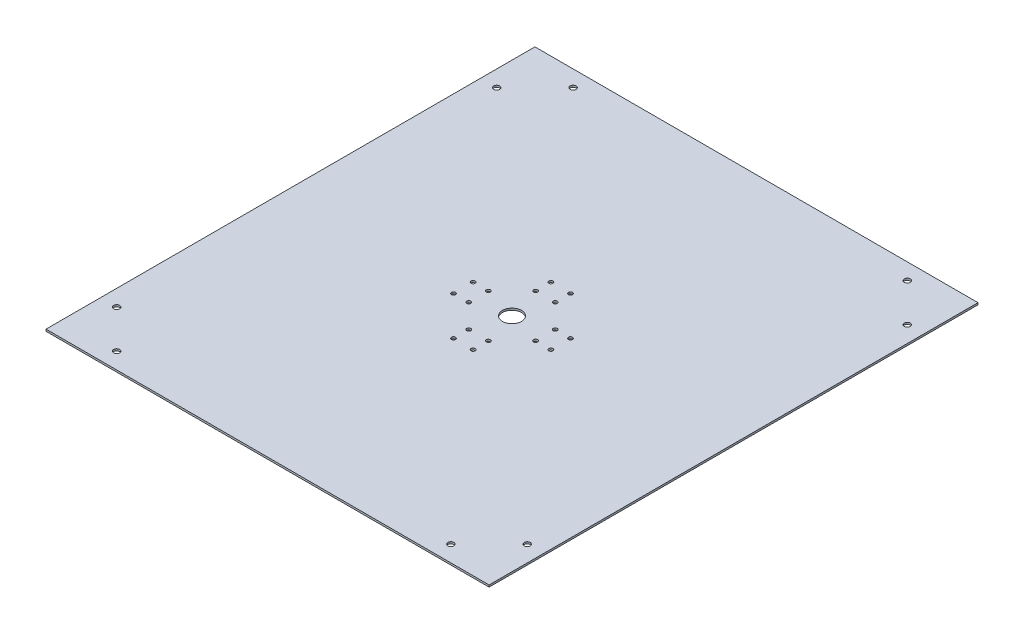
ISO-10303-21;
HEADER;
FILE_DESCRIPTION(('STEP AP214'),'2;1');
FILE_NAME('part.step','',(''),(''),'','','');
FILE_SCHEMA(('AUTOMOTIVE_DESIGN { 1 0 10303 214 1 1 1 1 }'));
ENDSEC;
DATA;
#1=APPLICATION_CONTEXT('core data for automotive mechanical design processes');
#2=APPLICATION_PROTOCOL_DEFINITION('international standard','automotive_design',2000,#1);
#3=PRODUCT_CONTEXT('',#1,'mechanical');
#4=PRODUCT('Part','Part','',(#3));
#5=PRODUCT_RELATED_PRODUCT_CATEGORY('part','',(#4));
#6=PRODUCT_DEFINITION_FORMATION('','',#4);
#7=PRODUCT_DEFINITION_CONTEXT('part definition',#1,'design');
#8=PRODUCT_DEFINITION('design','',#6,#7);
#9=PRODUCT_DEFINITION_SHAPE('','',#8);
#10=(LENGTH_UNIT() NAMED_UNIT(*) SI_UNIT(.MILLI.,.METRE.));
#11=(NAMED_UNIT(*) PLANE_ANGLE_UNIT() SI_UNIT($,.RADIAN.));
#12=(NAMED_UNIT(*) SI_UNIT($,.STERADIAN.) SOLID_ANGLE_UNIT());
#13=UNCERTAINTY_MEASURE_WITH_UNIT(LENGTH_MEASURE(1.E-05),#10,'distance_accuracy_value','');
#14=(GEOMETRIC_REPRESENTATION_CONTEXT(3) GLOBAL_UNCERTAINTY_ASSIGNED_CONTEXT((#13)) GLOBAL_UNIT_ASSIGNED_CONTEXT((#10,
#11,#12)) REPRESENTATION_CONTEXT('',''));
#15=CARTESIAN_POINT('',(0.,0.,0.));
#16=DIRECTION('',(0.,0.,1.));
#17=DIRECTION('',(1.,0.,0.));
#18=AXIS2_PLACEMENT_3D('',#15,#16,#17);
#19=CARTESIAN_POINT('',(232.,2.,256.));
#20=DIRECTION('',(-1.,0.,0.));
#21=DIRECTION('',(0.,0.,1.));
#22=AXIS2_PLACEMENT_3D('',#19,#20,#21);
#23=PLANE('',#22);
#24=DIRECTION('',(0.,0.,-1.));
#25=VECTOR('',#24,1.);
#26=CARTESIAN_POINT('',(232.,0.,256.));
#27=LINE('',#26,#25);
#28=CARTESIAN_POINT('',(232.,0.,256.));
#29=VERTEX_POINT('',#28);
#30=CARTESIAN_POINT('',(232.,0.,-256.));
#31=VERTEX_POINT('',#30);
#32=EDGE_CURVE('E113',#29,#31,#27,.T.);
#33=ORIENTED_EDGE('',*,*,#32,.T.);
#34=DIRECTION('',(0.,-1.,0.));
#35=VECTOR('',#34,1.);
#36=CARTESIAN_POINT('',(232.,2.,-256.));
#37=LINE('',#36,#35);
#38=CARTESIAN_POINT('',(232.,2.,-256.));
#39=VERTEX_POINT('',#38);
#40=EDGE_CURVE('E11',#39,#31,#37,.T.);
#41=ORIENTED_EDGE('',*,*,#40,.F.);
#42=DIRECTION('',(0.,0.,-1.));
#43=VECTOR('',#42,1.);
#44=CARTESIAN_POINT('',(232.,2.,256.));
#45=LINE('',#44,#43);
#46=CARTESIAN_POINT('',(232.,2.,256.));
#47=VERTEX_POINT('',#46);
#48=EDGE_CURVE('E96',#47,#39,#45,.T.);
#49=ORIENTED_EDGE('',*,*,#48,.F.);
#50=DIRECTION('',(0.,-1.,0.));
#51=VECTOR('',#50,1.);
#52=CARTESIAN_POINT('',(232.,2.,256.));
#53=LINE('',#52,#51);
#54=EDGE_CURVE('E109',#47,#29,#53,.T.);
#55=ORIENTED_EDGE('',*,*,#54,.T.);
#56=EDGE_LOOP('',(#33,#41,#49,#55));
#57=FACE_BOUND('',#56,.T.);
#58=ADVANCED_FACE('F42',(#57),#23,.F.);
#59=CARTESIAN_POINT('',(-232.,2.,-256.));
#60=DIRECTION('',(0.,0.,1.));
#61=DIRECTION('',(1.,0.,0.));
#62=AXIS2_PLACEMENT_3D('',#59,#60,#61);
#63=PLANE('',#62);
#64=DIRECTION('',(-1.,0.,0.));
#65=VECTOR('',#64,1.);
#66=CARTESIAN_POINT('',(-232.,0.,-256.));
#67=LINE('',#66,#65);
#68=CARTESIAN_POINT('',(-232.,0.,-256.));
#69=VERTEX_POINT('',#68);
#70=EDGE_CURVE('E101',#31,#69,#67,.T.);
#71=ORIENTED_EDGE('',*,*,#70,.T.);
#72=DIRECTION('',(0.,-1.,0.));
#73=VECTOR('',#72,1.);
#74=CARTESIAN_POINT('',(-232.,2.,-256.));
#75=LINE('',#74,#73);
#76=CARTESIAN_POINT('',(-232.,2.,-256.));
#77=VERTEX_POINT('',#76);
#78=EDGE_CURVE('E52',#77,#69,#75,.T.);
#79=ORIENTED_EDGE('',*,*,#78,.F.);
#80=DIRECTION('',(-1.,0.,0.));
#81=VECTOR('',#80,1.);
#82=CARTESIAN_POINT('',(-232.,2.,-256.));
#83=LINE('',#82,#81);
#84=EDGE_CURVE('E91',#39,#77,#83,.T.);
#85=ORIENTED_EDGE('',*,*,#84,.F.);
#86=ORIENTED_EDGE('',*,*,#40,.T.);
#87=EDGE_LOOP('',(#71,#79,#85,#86));
#88=FACE_BOUND('',#87,.T.);
#89=ADVANCED_FACE('F100',(#88),#63,.F.);
#90=CARTESIAN_POINT('',(-232.,2.,256.));
#91=DIRECTION('',(1.,0.,0.));
#92=DIRECTION('',(0.,0.,-1.));
#93=AXIS2_PLACEMENT_3D('',#90,#91,#92);
#94=PLANE('',#93);
#95=DIRECTION('',(0.,0.,1.));
#96=VECTOR('',#95,1.);
#97=CARTESIAN_POINT('',(-232.,0.,256.));
#98=LINE('',#97,#96);
#99=CARTESIAN_POINT('',(-232.,0.,256.));
#100=VERTEX_POINT('',#99);
#101=EDGE_CURVE('E78',#69,#100,#98,.T.);
#102=ORIENTED_EDGE('',*,*,#101,.T.);
#103=DIRECTION('',(0.,-1.,0.));
#104=VECTOR('',#103,1.);
#105=CARTESIAN_POINT('',(-232.,2.,256.));
#106=LINE('',#105,#104);
#107=CARTESIAN_POINT('',(-232.,2.,256.));
#108=VERTEX_POINT('',#107);
#109=EDGE_CURVE('E103',#108,#100,#106,.T.);
#110=ORIENTED_EDGE('',*,*,#109,.F.);
#111=DIRECTION('',(0.,0.,1.));
#112=VECTOR('',#111,1.);
#113=CARTESIAN_POINT('',(-232.,2.,256.));
#114=LINE('',#113,#112);
#115=EDGE_CURVE('E94',#77,#108,#114,.T.);
#116=ORIENTED_EDGE('',*,*,#115,.F.);
#117=ORIENTED_EDGE('',*,*,#78,.T.);
#118=EDGE_LOOP('',(#102,#110,#116,#117));
#119=FACE_BOUND('',#118,.T.);
#120=ADVANCED_FACE('F105',(#119),#94,.F.);
#121=CARTESIAN_POINT('',(-232.,2.,256.));
#122=DIRECTION('',(0.,0.,-1.));
#123=DIRECTION('',(-1.,0.,0.));
#124=AXIS2_PLACEMENT_3D('',#121,#122,#123);
#125=PLANE('',#124);
#126=DIRECTION('',(1.,0.,0.));
#127=VECTOR('',#126,1.);
#128=CARTESIAN_POINT('',(-232.,0.,256.));
#129=LINE('',#128,#127);
#130=EDGE_CURVE('E84',#100,#29,#129,.T.);
#131=ORIENTED_EDGE('',*,*,#130,.T.);
#132=ORIENTED_EDGE('',*,*,#54,.F.);
#133=DIRECTION('',(1.,0.,0.));
#134=VECTOR('',#133,1.);
#135=CARTESIAN_POINT('',(-232.,2.,256.));
#136=LINE('',#135,#134);
#137=EDGE_CURVE('E61',#108,#47,#136,.T.);
#138=ORIENTED_EDGE('',*,*,#137,.F.);
#139=ORIENTED_EDGE('',*,*,#109,.T.);
#140=EDGE_LOOP('',(#131,#132,#138,#139));
#141=FACE_BOUND('',#140,.T.);
#142=ADVANCED_FACE('F339',(#141),#125,.F.);
#143=CARTESIAN_POINT('',(0.,2.,0.));
#144=DIRECTION('',(0.,-1.,0.));
#145=DIRECTION('',(0.,0.,-1.));
#146=AXIS2_PLACEMENT_3D('',#143,#144,#145);
#147=PLANE('',#146);
#148=CARTESIAN_POINT('',(175.,2.,239.));
#149=DIRECTION('',(0.,1.,0.));
#150=DIRECTION('',(0.,0.,-1.));
#151=AXIS2_PLACEMENT_3D('',#148,#149,#150);
#152=CIRCLE('',#151,3.15000000000002);
#153=CARTESIAN_POINT('',(175.,2.,235.85));
#154=VERTEX_POINT('',#153);
#155=EDGE_CURVE('E314',#154,#154,#152,.T.);
#156=ORIENTED_EDGE('',*,*,#155,.F.);
#157=EDGE_LOOP('',(#156));
#158=FACE_BOUND('',#157,.T.);
#159=CARTESIAN_POINT('',(-175.,2.,-239.));
#160=DIRECTION('',(0.,1.,0.));
#161=DIRECTION('',(0.,0.,-1.));
#162=AXIS2_PLACEMENT_3D('',#159,#160,#161);
#163=CIRCLE('',#162,3.15000000000002);
#164=CARTESIAN_POINT('',(-175.,2.,-242.15));
#165=VERTEX_POINT('',#164);
#166=EDGE_CURVE('E310',#165,#165,#163,.T.);
#167=ORIENTED_EDGE('',*,*,#166,.F.);
#168=EDGE_LOOP('',(#167));
#169=FACE_BOUND('',#168,.T.);
#170=CARTESIAN_POINT('',(-215.,2.,-199.));
#171=DIRECTION('',(0.,1.,0.));
#172=DIRECTION('',(0.,0.,-1.));
#173=AXIS2_PLACEMENT_3D('',#170,#171,#172);
#174=CIRCLE('',#173,3.14999999999998);
#175=CARTESIAN_POINT('',(-215.,2.,-202.15));
#176=VERTEX_POINT('',#175);
#177=EDGE_CURVE('E306',#176,#176,#174,.T.);
#178=ORIENTED_EDGE('',*,*,#177,.F.);
#179=EDGE_LOOP('',(#178));
#180=FACE_BOUND('',#179,.T.);
#181=CARTESIAN_POINT('',(-175.,2.,239.));
#182=DIRECTION('',(0.,1.,0.));
#183=DIRECTION('',(0.,0.,1.));
#184=AXIS2_PLACEMENT_3D('',#181,#182,#183);
#185=CIRCLE('',#184,3.15000000000002);
#186=CARTESIAN_POINT('',(-175.,2.,242.15));
#187=VERTEX_POINT('',#186);
#188=EDGE_CURVE('E305',#187,#187,#185,.T.);
#189=ORIENTED_EDGE('',*,*,#188,.F.);
#190=EDGE_LOOP('',(#189));
#191=FACE_BOUND('',#190,.T.);
#192=CARTESIAN_POINT('',(215.,2.,199.));
#193=DIRECTION('',(0.,1.,0.));
#194=DIRECTION('',(0.,0.,-1.));
#195=AXIS2_PLACEMENT_3D('',#192,#193,#194);
#196=CIRCLE('',#195,3.14999999999998);
#197=CARTESIAN_POINT('',(215.,2.,195.85));
#198=VERTEX_POINT('',#197);
#199=EDGE_CURVE('E318',#198,#198,#196,.T.);
#200=ORIENTED_EDGE('',*,*,#199,.F.);
#201=EDGE_LOOP('',(#200));
#202=FACE_BOUND('',#201,.T.);
#203=CARTESIAN_POINT('',(215.,2.,-199.));
#204=DIRECTION('',(0.,1.,0.));
#205=DIRECTION('',(0.,0.,1.));
#206=AXIS2_PLACEMENT_3D('',#203,#204,#205);
#207=CIRCLE('',#206,3.14999999999998);
#208=CARTESIAN_POINT('',(215.,2.,-195.85));
#209=VERTEX_POINT('',#208);
#210=EDGE_CURVE('E326',#209,#209,#207,.T.);
#211=ORIENTED_EDGE('',*,*,#210,.F.);
#212=EDGE_LOOP('',(#211));
#213=FACE_BOUND('',#212,.T.);
#214=CARTESIAN_POINT('',(175.,2.,-239.));
#215=DIRECTION('',(0.,1.,0.));
#216=DIRECTION('',(0.,0.,1.));
#217=AXIS2_PLACEMENT_3D('',#214,#215,#216);
#218=CIRCLE('',#217,3.15000000000002);
#219=CARTESIAN_POINT('',(175.,2.,-235.85));
#220=VERTEX_POINT('',#219);
#221=EDGE_CURVE('E322',#220,#220,#218,.T.);
#222=ORIENTED_EDGE('',*,*,#221,.F.);
#223=EDGE_LOOP('',(#222));
#224=FACE_BOUND('',#223,.T.);
#225=CARTESIAN_POINT('',(-215.,2.,199.));
#226=DIRECTION('',(0.,1.,0.));
#227=DIRECTION('',(0.,0.,1.));
#228=AXIS2_PLACEMENT_3D('',#225,#226,#227);
#229=CIRCLE('',#228,3.14999999999998);
#230=CARTESIAN_POINT('',(-215.,2.,202.15));
#231=VERTEX_POINT('',#230);
#232=EDGE_CURVE('E202',#231,#231,#229,.T.);
#233=ORIENTED_EDGE('',*,*,#232,.F.);
#234=EDGE_LOOP('',(#233));
#235=FACE_BOUND('',#234,.T.);
#236=CARTESIAN_POINT('',(35.,2.,-10.25));
#237=DIRECTION('',(0.,1.,0.));
#238=DIRECTION('',(0.,0.,1.));
#239=AXIS2_PLACEMENT_3D('',#236,#237,#238);
#240=CIRCLE('',#239,2.15);
#241=CARTESIAN_POINT('',(35.,2.,-8.1));
#242=VERTEX_POINT('',#241);
#243=EDGE_CURVE('E268',#242,#242,#240,.T.);
#244=ORIENTED_EDGE('',*,*,#243,.F.);
#245=EDGE_LOOP('',(#244));
#246=FACE_BOUND('',#245,.T.);
#247=CARTESIAN_POINT('',(35.,2.,10.25));
#248=DIRECTION('',(0.,1.,0.));
#249=DIRECTION('',(0.,0.,-1.));
#250=AXIS2_PLACEMENT_3D('',#247,#248,#249);
#251=CIRCLE('',#250,2.15);
#252=CARTESIAN_POINT('',(35.,2.,8.10000000000001));
#253=VERTEX_POINT('',#252);
#254=EDGE_CURVE('E264',#253,#253,#251,.T.);
#255=ORIENTED_EDGE('',*,*,#254,.F.);
#256=EDGE_LOOP('',(#255));
#257=FACE_BOUND('',#256,.T.);
#258=CARTESIAN_POINT('',(51.,2.,10.25));
#259=DIRECTION('',(0.,1.,0.));
#260=DIRECTION('',(0.,0.,-1.));
#261=AXIS2_PLACEMENT_3D('',#258,#259,#260);
#262=CIRCLE('',#261,2.15);
#263=CARTESIAN_POINT('',(51.,2.,8.1));
#264=VERTEX_POINT('',#263);
#265=EDGE_CURVE('E260',#264,#264,#262,.T.);
#266=ORIENTED_EDGE('',*,*,#265,.F.);
#267=EDGE_LOOP('',(#266));
#268=FACE_BOUND('',#267,.T.);
#269=CARTESIAN_POINT('',(10.25,2.,51.));
#270=DIRECTION('',(0.,1.,0.));
#271=DIRECTION('',(0.,0.,1.));
#272=AXIS2_PLACEMENT_3D('',#269,#270,#271);
#273=CIRCLE('',#272,2.15);
#274=CARTESIAN_POINT('',(10.25,2.,53.15));
#275=VERTEX_POINT('',#274);
#276=EDGE_CURVE('E256',#275,#275,#273,.T.);
#277=ORIENTED_EDGE('',*,*,#276,.F.);
#278=EDGE_LOOP('',(#277));
#279=FACE_BOUND('',#278,.T.);
#280=CARTESIAN_POINT('',(-10.25,2.,-35.));
#281=DIRECTION('',(0.,1.,0.));
#282=DIRECTION('',(0.,0.,1.));
#283=AXIS2_PLACEMENT_3D('',#280,#281,#282);
#284=CIRCLE('',#283,2.15);
#285=CARTESIAN_POINT('',(-10.25,2.,-32.85));
#286=VERTEX_POINT('',#285);
#287=EDGE_CURVE('E284',#286,#286,#284,.T.);
#288=ORIENTED_EDGE('',*,*,#287,.F.);
#289=EDGE_LOOP('',(#288));
#290=FACE_BOUND('',#289,.T.);
#291=CARTESIAN_POINT('',(10.25,2.,-35.));
#292=DIRECTION('',(0.,1.,0.));
#293=DIRECTION('',(0.,0.,-1.));
#294=AXIS2_PLACEMENT_3D('',#291,#292,#293);
#295=CIRCLE('',#294,2.15);
#296=CARTESIAN_POINT('',(10.25,2.,-37.15));
#297=VERTEX_POINT('',#296);
#298=EDGE_CURVE('E280',#297,#297,#295,.T.);
#299=ORIENTED_EDGE('',*,*,#298,.F.);
#300=EDGE_LOOP('',(#299));
#301=FACE_BOUND('',#300,.T.);
#302=CARTESIAN_POINT('',(10.25,2.,-51.));
#303=DIRECTION('',(0.,1.,0.));
#304=DIRECTION('',(0.,0.,-1.));
#305=AXIS2_PLACEMENT_3D('',#302,#303,#304);
#306=CIRCLE('',#305,2.15);
#307=CARTESIAN_POINT('',(10.25,2.,-53.15));
#308=VERTEX_POINT('',#307);
#309=EDGE_CURVE('E276',#308,#308,#306,.T.);
#310=ORIENTED_EDGE('',*,*,#309,.F.);
#311=EDGE_LOOP('',(#310));
#312=FACE_BOUND('',#311,.T.);
#313=CARTESIAN_POINT('',(51.,2.,-10.25));
#314=DIRECTION('',(0.,1.,0.));
#315=DIRECTION('',(0.,0.,1.));
#316=AXIS2_PLACEMENT_3D('',#313,#314,#315);
#317=CIRCLE('',#316,2.15);
#318=CARTESIAN_POINT('',(51.,2.,-8.1));
#319=VERTEX_POINT('',#318);
#320=EDGE_CURVE('E272',#319,#319,#317,.T.);
#321=ORIENTED_EDGE('',*,*,#320,.F.);
#322=EDGE_LOOP('',(#321));
#323=FACE_BOUND('',#322,.T.);
#324=CARTESIAN_POINT('',(-51.,2.,-10.25));
#325=DIRECTION('',(0.,1.,0.));
#326=DIRECTION('',(0.,0.,-1.));
#327=AXIS2_PLACEMENT_3D('',#324,#325,#326);
#328=CIRCLE('',#327,2.15);
#329=CARTESIAN_POINT('',(-51.,2.,-12.4));
#330=VERTEX_POINT('',#329);
#331=EDGE_CURVE('E228',#330,#330,#328,.T.);
#332=ORIENTED_EDGE('',*,*,#331,.F.);
#333=EDGE_LOOP('',(#332));
#334=FACE_BOUND('',#333,.T.);
#335=CARTESIAN_POINT('',(-35.,2.,-10.25));
#336=DIRECTION('',(0.,1.,0.));
#337=DIRECTION('',(0.,0.,-1.));
#338=AXIS2_PLACEMENT_3D('',#335,#336,#337);
#339=CIRCLE('',#338,2.15);
#340=CARTESIAN_POINT('',(-35.,2.,-12.4));
#341=VERTEX_POINT('',#340);
#342=EDGE_CURVE('E233',#341,#341,#339,.T.);
#343=ORIENTED_EDGE('',*,*,#342,.F.);
#344=EDGE_LOOP('',(#343));
#345=FACE_BOUND('',#344,.T.);
#346=CARTESIAN_POINT('',(-35.,2.,10.25));
#347=DIRECTION('',(0.,1.,0.));
#348=DIRECTION('',(0.,0.,1.));
#349=AXIS2_PLACEMENT_3D('',#346,#347,#348);
#350=CIRCLE('',#349,2.15);
#351=CARTESIAN_POINT('',(-35.,2.,12.4));
#352=VERTEX_POINT('',#351);
#353=EDGE_CURVE('E239',#352,#352,#350,.T.);
#354=ORIENTED_EDGE('',*,*,#353,.F.);
#355=EDGE_LOOP('',(#354));
#356=FACE_BOUND('',#355,.T.);
#357=CARTESIAN_POINT('',(10.25,2.,35.));
#358=DIRECTION('',(0.,1.,0.));
#359=DIRECTION('',(0.,0.,1.));
#360=AXIS2_PLACEMENT_3D('',#357,#358,#359);
#361=CIRCLE('',#360,2.15);
#362=CARTESIAN_POINT('',(10.25,2.,37.15));
#363=VERTEX_POINT('',#362);
#364=EDGE_CURVE('E252',#363,#363,#361,.T.);
#365=ORIENTED_EDGE('',*,*,#364,.F.);
#366=EDGE_LOOP('',(#365));
#367=FACE_BOUND('',#366,.T.);
#368=CARTESIAN_POINT('',(-10.25,2.,35.));
#369=DIRECTION('',(0.,1.,0.));
#370=DIRECTION('',(0.,0.,-1.));
#371=AXIS2_PLACEMENT_3D('',#368,#369,#370);
#372=CIRCLE('',#371,2.15);
#373=CARTESIAN_POINT('',(-10.25,2.,32.85));
#374=VERTEX_POINT('',#373);
#375=EDGE_CURVE('E247',#374,#374,#372,.T.);
#376=ORIENTED_EDGE('',*,*,#375,.F.);
#377=EDGE_LOOP('',(#376));
#378=FACE_BOUND('',#377,.T.);
#379=CARTESIAN_POINT('',(-10.25,2.,51.));
#380=DIRECTION('',(0.,1.,0.));
#381=DIRECTION('',(0.,0.,-1.));
#382=AXIS2_PLACEMENT_3D('',#379,#380,#381);
#383=CIRCLE('',#382,2.15);
#384=CARTESIAN_POINT('',(-10.25,2.,48.85));
#385=VERTEX_POINT('',#384);
#386=EDGE_CURVE('E243',#385,#385,#383,.T.);
#387=ORIENTED_EDGE('',*,*,#386,.F.);
#388=EDGE_LOOP('',(#387));
#389=FACE_BOUND('',#388,.T.);
#390=CARTESIAN_POINT('',(-51.,2.,10.25));
#391=DIRECTION('',(0.,1.,0.));
#392=DIRECTION('',(0.,0.,1.));
#393=AXIS2_PLACEMENT_3D('',#390,#391,#392);
#394=CIRCLE('',#393,2.15);
#395=CARTESIAN_POINT('',(-51.,2.,12.4));
#396=VERTEX_POINT('',#395);
#397=EDGE_CURVE('E248',#396,#396,#394,.T.);
#398=ORIENTED_EDGE('',*,*,#397,.F.);
#399=EDGE_LOOP('',(#398));
#400=FACE_BOUND('',#399,.T.);
#401=CARTESIAN_POINT('',(-10.25,2.,-51.));
#402=DIRECTION('',(0.,1.,0.));
#403=DIRECTION('',(0.,0.,1.));
#404=AXIS2_PLACEMENT_3D('',#401,#402,#403);
#405=CIRCLE('',#404,2.15);
#406=CARTESIAN_POINT('',(-10.25,2.,-48.85));
#407=VERTEX_POINT('',#406);
#408=EDGE_CURVE('E137',#407,#407,#405,.T.);
#409=ORIENTED_EDGE('',*,*,#408,.F.);
#410=EDGE_LOOP('',(#409));
#411=FACE_BOUND('',#410,.T.);
#412=CARTESIAN_POINT('',(0.,2.,0.));
#413=DIRECTION('',(0.,1.,0.));
#414=DIRECTION('',(0.,0.,1.));
#415=AXIS2_PLACEMENT_3D('',#412,#413,#414);
#416=CIRCLE('',#415,10.);
#417=CARTESIAN_POINT('',(0.,2.,10.));
#418=VERTEX_POINT('',#417);
#419=EDGE_CURVE('E131',#418,#418,#416,.T.);
#420=ORIENTED_EDGE('',*,*,#419,.F.);
#421=EDGE_LOOP('',(#420));
#422=FACE_BOUND('',#421,.T.);
#423=ORIENTED_EDGE('',*,*,#48,.T.);
#424=ORIENTED_EDGE('',*,*,#84,.T.);
#425=ORIENTED_EDGE('',*,*,#115,.T.);
#426=ORIENTED_EDGE('',*,*,#137,.T.);
#427=EDGE_LOOP('',(#423,#424,#425,#426));
#428=FACE_BOUND('',#427,.T.);
#429=ADVANCED_FACE('F92',(#158,#169,#180,#191,#202,#213,#224,#235,#246,#257,#268,#279,#290,#301,
#312,#323,#334,#345,#356,#367,#378,#389,#400,#411,#422,#428),#147,.F.);
#430=CARTESIAN_POINT('',(0.,0.,0.));
#431=DIRECTION('',(0.,-1.,0.));
#432=DIRECTION('',(0.,0.,-1.));
#433=AXIS2_PLACEMENT_3D('',#430,#431,#432);
#434=PLANE('',#433);
#435=CARTESIAN_POINT('',(175.,0.,239.));
#436=DIRECTION('',(0.,-1.,0.));
#437=DIRECTION('',(0.,0.,-1.));
#438=AXIS2_PLACEMENT_3D('',#435,#436,#437);
#439=CIRCLE('',#438,3.15000000000002);
#440=CARTESIAN_POINT('',(175.,0.,235.85));
#441=VERTEX_POINT('',#440);
#442=EDGE_CURVE('E45',#441,#441,#439,.T.);
#443=ORIENTED_EDGE('',*,*,#442,.F.);
#444=EDGE_LOOP('',(#443));
#445=FACE_BOUND('',#444,.T.);
#446=CARTESIAN_POINT('',(-175.,0.,-239.));
#447=DIRECTION('',(0.,-1.,0.));
#448=DIRECTION('',(0.,0.,-1.));
#449=AXIS2_PLACEMENT_3D('',#446,#447,#448);
#450=CIRCLE('',#449,3.15000000000002);
#451=CARTESIAN_POINT('',(-175.,0.,-242.15));
#452=VERTEX_POINT('',#451);
#453=EDGE_CURVE('E221',#452,#452,#450,.T.);
#454=ORIENTED_EDGE('',*,*,#453,.F.);
#455=EDGE_LOOP('',(#454));
#456=FACE_BOUND('',#455,.T.);
#457=CARTESIAN_POINT('',(-215.,0.,-199.));
#458=DIRECTION('',(0.,-1.,0.));
#459=DIRECTION('',(0.,0.,-1.));
#460=AXIS2_PLACEMENT_3D('',#457,#458,#459);
#461=CIRCLE('',#460,3.14999999999998);
#462=CARTESIAN_POINT('',(-215.,0.,-202.15));
#463=VERTEX_POINT('',#462);
#464=EDGE_CURVE('E218',#463,#463,#461,.T.);
#465=ORIENTED_EDGE('',*,*,#464,.F.);
#466=EDGE_LOOP('',(#465));
#467=FACE_BOUND('',#466,.T.);
#468=CARTESIAN_POINT('',(-175.,0.,239.));
#469=DIRECTION('',(0.,-1.,0.));
#470=DIRECTION('',(0.,0.,-1.));
#471=AXIS2_PLACEMENT_3D('',#468,#469,#470);
#472=CIRCLE('',#471,3.15000000000002);
#473=CARTESIAN_POINT('',(-175.,0.,235.85));
#474=VERTEX_POINT('',#473);
#475=EDGE_CURVE('E214',#474,#474,#472,.T.);
#476=ORIENTED_EDGE('',*,*,#475,.F.);
#477=EDGE_LOOP('',(#476));
#478=FACE_BOUND('',#477,.T.);
#479=CARTESIAN_POINT('',(215.,0.,199.));
#480=DIRECTION('',(0.,-1.,0.));
#481=DIRECTION('',(0.,0.,-1.));
#482=AXIS2_PLACEMENT_3D('',#479,#480,#481);
#483=CIRCLE('',#482,3.14999999999998);
#484=CARTESIAN_POINT('',(215.,0.,195.85));
#485=VERTEX_POINT('',#484);
#486=EDGE_CURVE('E210',#485,#485,#483,.T.);
#487=ORIENTED_EDGE('',*,*,#486,.F.);
#488=EDGE_LOOP('',(#487));
#489=FACE_BOUND('',#488,.T.);
#490=CARTESIAN_POINT('',(215.,0.,-199.));
#491=DIRECTION('',(0.,-1.,0.));
#492=DIRECTION('',(0.,0.,-1.));
#493=AXIS2_PLACEMENT_3D('',#490,#491,#492);
#494=CIRCLE('',#493,3.14999999999998);
#495=CARTESIAN_POINT('',(215.,0.,-202.15));
#496=VERTEX_POINT('',#495);
#497=EDGE_CURVE('E206',#496,#496,#494,.T.);
#498=ORIENTED_EDGE('',*,*,#497,.F.);
#499=EDGE_LOOP('',(#498));
#500=FACE_BOUND('',#499,.T.);
#501=CARTESIAN_POINT('',(175.,0.,-239.));
#502=DIRECTION('',(0.,-1.,0.));
#503=DIRECTION('',(0.,0.,-1.));
#504=AXIS2_PLACEMENT_3D('',#501,#502,#503);
#505=CIRCLE('',#504,3.15000000000002);
#506=CARTESIAN_POINT('',(175.,0.,-242.15));
#507=VERTEX_POINT('',#506);
#508=EDGE_CURVE('E201',#507,#507,#505,.T.);
#509=ORIENTED_EDGE('',*,*,#508,.F.);
#510=EDGE_LOOP('',(#509));
#511=FACE_BOUND('',#510,.T.);
#512=CARTESIAN_POINT('',(-215.,0.,199.));
#513=DIRECTION('',(0.,-1.,0.));
#514=DIRECTION('',(0.,0.,-1.));
#515=AXIS2_PLACEMENT_3D('',#512,#513,#514);
#516=CIRCLE('',#515,3.14999999999998);
#517=CARTESIAN_POINT('',(-215.,0.,195.85));
#518=VERTEX_POINT('',#517);
#519=EDGE_CURVE('E197',#518,#518,#516,.T.);
#520=ORIENTED_EDGE('',*,*,#519,.F.);
#521=EDGE_LOOP('',(#520));
#522=FACE_BOUND('',#521,.T.);
#523=CARTESIAN_POINT('',(35.,0.,-10.25));
#524=DIRECTION('',(0.,-1.,0.));
#525=DIRECTION('',(0.,0.,-1.));
#526=AXIS2_PLACEMENT_3D('',#523,#524,#525);
#527=CIRCLE('',#526,2.15);
#528=CARTESIAN_POINT('',(35.,0.,-12.4));
#529=VERTEX_POINT('',#528);
#530=EDGE_CURVE('E193',#529,#529,#527,.T.);
#531=ORIENTED_EDGE('',*,*,#530,.F.);
#532=EDGE_LOOP('',(#531));
#533=FACE_BOUND('',#532,.T.);
#534=CARTESIAN_POINT('',(35.,0.,10.25));
#535=DIRECTION('',(0.,-1.,0.));
#536=DIRECTION('',(0.,0.,-1.));
#537=AXIS2_PLACEMENT_3D('',#534,#535,#536);
#538=CIRCLE('',#537,2.15);
#539=CARTESIAN_POINT('',(35.,0.,8.10000000000001));
#540=VERTEX_POINT('',#539);
#541=EDGE_CURVE('E189',#540,#540,#538,.T.);
#542=ORIENTED_EDGE('',*,*,#541,.F.);
#543=EDGE_LOOP('',(#542));
#544=FACE_BOUND('',#543,.T.);
#545=CARTESIAN_POINT('',(51.,0.,10.25));
#546=DIRECTION('',(0.,-1.,0.));
#547=DIRECTION('',(0.,0.,-1.));
#548=AXIS2_PLACEMENT_3D('',#545,#546,#547);
#549=CIRCLE('',#548,2.15);
#550=CARTESIAN_POINT('',(51.,0.,8.1));
#551=VERTEX_POINT('',#550);
#552=EDGE_CURVE('E185',#551,#551,#549,.T.);
#553=ORIENTED_EDGE('',*,*,#552,.F.);
#554=EDGE_LOOP('',(#553));
#555=FACE_BOUND('',#554,.T.);
#556=CARTESIAN_POINT('',(10.25,0.,51.));
#557=DIRECTION('',(0.,-1.,0.));
#558=DIRECTION('',(0.,0.,-1.));
#559=AXIS2_PLACEMENT_3D('',#556,#557,#558);
#560=CIRCLE('',#559,2.15);
#561=CARTESIAN_POINT('',(10.25,0.,48.85));
#562=VERTEX_POINT('',#561);
#563=EDGE_CURVE('E181',#562,#562,#560,.T.);
#564=ORIENTED_EDGE('',*,*,#563,.F.);
#565=EDGE_LOOP('',(#564));
#566=FACE_BOUND('',#565,.T.);
#567=CARTESIAN_POINT('',(-10.25,0.,-35.));
#568=DIRECTION('',(0.,-1.,0.));
#569=DIRECTION('',(0.,0.,-1.));
#570=AXIS2_PLACEMENT_3D('',#567,#568,#569);
#571=CIRCLE('',#570,2.15);
#572=CARTESIAN_POINT('',(-10.25,0.,-37.15));
#573=VERTEX_POINT('',#572);
#574=EDGE_CURVE('E177',#573,#573,#571,.T.);
#575=ORIENTED_EDGE('',*,*,#574,.F.);
#576=EDGE_LOOP('',(#575));
#577=FACE_BOUND('',#576,.T.);
#578=CARTESIAN_POINT('',(10.25,0.,-35.));
#579=DIRECTION('',(0.,-1.,0.));
#580=DIRECTION('',(0.,0.,-1.));
#581=AXIS2_PLACEMENT_3D('',#578,#579,#580);
#582=CIRCLE('',#581,2.15);
#583=CARTESIAN_POINT('',(10.25,0.,-37.15));
#584=VERTEX_POINT('',#583);
#585=EDGE_CURVE('E173',#584,#584,#582,.T.);
#586=ORIENTED_EDGE('',*,*,#585,.F.);
#587=EDGE_LOOP('',(#586));
#588=FACE_BOUND('',#587,.T.);
#589=CARTESIAN_POINT('',(10.25,0.,-51.));
#590=DIRECTION('',(0.,-1.,0.));
#591=DIRECTION('',(0.,0.,-1.));
#592=AXIS2_PLACEMENT_3D('',#589,#590,#591);
#593=CIRCLE('',#592,2.15);
#594=CARTESIAN_POINT('',(10.25,0.,-53.15));
#595=VERTEX_POINT('',#594);
#596=EDGE_CURVE('E169',#595,#595,#593,.T.);
#597=ORIENTED_EDGE('',*,*,#596,.F.);
#598=EDGE_LOOP('',(#597));
#599=FACE_BOUND('',#598,.T.);
#600=CARTESIAN_POINT('',(51.,0.,-10.25));
#601=DIRECTION('',(0.,-1.,0.));
#602=DIRECTION('',(0.,0.,-1.));
#603=AXIS2_PLACEMENT_3D('',#600,#601,#602);
#604=CIRCLE('',#603,2.15);
#605=CARTESIAN_POINT('',(51.,0.,-12.4));
#606=VERTEX_POINT('',#605);
#607=EDGE_CURVE('E165',#606,#606,#604,.T.);
#608=ORIENTED_EDGE('',*,*,#607,.F.);
#609=EDGE_LOOP('',(#608));
#610=FACE_BOUND('',#609,.T.);
#611=CARTESIAN_POINT('',(-51.,0.,-10.25));
#612=DIRECTION('',(0.,-1.,0.));
#613=DIRECTION('',(0.,0.,-1.));
#614=AXIS2_PLACEMENT_3D('',#611,#612,#613);
#615=CIRCLE('',#614,2.15);
#616=CARTESIAN_POINT('',(-51.,0.,-12.4));
#617=VERTEX_POINT('',#616);
#618=EDGE_CURVE('E161',#617,#617,#615,.T.);
#619=ORIENTED_EDGE('',*,*,#618,.F.);
#620=EDGE_LOOP('',(#619));
#621=FACE_BOUND('',#620,.T.);
#622=CARTESIAN_POINT('',(-35.,0.,-10.25));
#623=DIRECTION('',(0.,-1.,0.));
#624=DIRECTION('',(0.,0.,-1.));
#625=AXIS2_PLACEMENT_3D('',#622,#623,#624);
#626=CIRCLE('',#625,2.15);
#627=CARTESIAN_POINT('',(-35.,0.,-12.4));
#628=VERTEX_POINT('',#627);
#629=EDGE_CURVE('E157',#628,#628,#626,.T.);
#630=ORIENTED_EDGE('',*,*,#629,.F.);
#631=EDGE_LOOP('',(#630));
#632=FACE_BOUND('',#631,.T.);
#633=CARTESIAN_POINT('',(-35.,0.,10.25));
#634=DIRECTION('',(0.,-1.,0.));
#635=DIRECTION('',(0.,0.,-1.));
#636=AXIS2_PLACEMENT_3D('',#633,#634,#635);
#637=CIRCLE('',#636,2.15);
#638=CARTESIAN_POINT('',(-35.,0.,8.1));
#639=VERTEX_POINT('',#638);
#640=EDGE_CURVE('E153',#639,#639,#637,.T.);
#641=ORIENTED_EDGE('',*,*,#640,.F.);
#642=EDGE_LOOP('',(#641));
#643=FACE_BOUND('',#642,.T.);
#644=CARTESIAN_POINT('',(10.25,0.,35.));
#645=DIRECTION('',(0.,-1.,0.));
#646=DIRECTION('',(0.,0.,-1.));
#647=AXIS2_PLACEMENT_3D('',#644,#645,#646);
#648=CIRCLE('',#647,2.15);
#649=CARTESIAN_POINT('',(10.25,0.,32.85));
#650=VERTEX_POINT('',#649);
#651=EDGE_CURVE('E149',#650,#650,#648,.T.);
#652=ORIENTED_EDGE('',*,*,#651,.F.);
#653=EDGE_LOOP('',(#652));
#654=FACE_BOUND('',#653,.T.);
#655=CARTESIAN_POINT('',(-10.25,0.,35.));
#656=DIRECTION('',(0.,-1.,0.));
#657=DIRECTION('',(0.,0.,-1.));
#658=AXIS2_PLACEMENT_3D('',#655,#656,#657);
#659=CIRCLE('',#658,2.15);
#660=CARTESIAN_POINT('',(-10.25,0.,32.85));
#661=VERTEX_POINT('',#660);
#662=EDGE_CURVE('E145',#661,#661,#659,.T.);
#663=ORIENTED_EDGE('',*,*,#662,.F.);
#664=EDGE_LOOP('',(#663));
#665=FACE_BOUND('',#664,.T.);
#666=CARTESIAN_POINT('',(-10.25,0.,51.));
#667=DIRECTION('',(0.,-1.,0.));
#668=DIRECTION('',(0.,0.,-1.));
#669=AXIS2_PLACEMENT_3D('',#666,#667,#668);
#670=CIRCLE('',#669,2.15);
#671=CARTESIAN_POINT('',(-10.25,0.,48.85));
#672=VERTEX_POINT('',#671);
#673=EDGE_CURVE('E141',#672,#672,#670,.T.);
#674=ORIENTED_EDGE('',*,*,#673,.F.);
#675=EDGE_LOOP('',(#674));
#676=FACE_BOUND('',#675,.T.);
#677=CARTESIAN_POINT('',(-51.,0.,10.25));
#678=DIRECTION('',(0.,-1.,0.));
#679=DIRECTION('',(0.,0.,-1.));
#680=AXIS2_PLACEMENT_3D('',#677,#678,#679);
#681=CIRCLE('',#680,2.15);
#682=CARTESIAN_POINT('',(-51.,0.,8.1));
#683=VERTEX_POINT('',#682);
#684=EDGE_CURVE('E136',#683,#683,#681,.T.);
#685=ORIENTED_EDGE('',*,*,#684,.F.);
#686=EDGE_LOOP('',(#685));
#687=FACE_BOUND('',#686,.T.);
#688=CARTESIAN_POINT('',(-10.25,0.,-51.));
#689=DIRECTION('',(0.,-1.,0.));
#690=DIRECTION('',(0.,0.,-1.));
#691=AXIS2_PLACEMENT_3D('',#688,#689,#690);
#692=CIRCLE('',#691,2.15);
#693=CARTESIAN_POINT('',(-10.25,0.,-53.15));
#694=VERTEX_POINT('',#693);
#695=EDGE_CURVE('E132',#694,#694,#692,.T.);
#696=ORIENTED_EDGE('',*,*,#695,.F.);
#697=EDGE_LOOP('',(#696));
#698=FACE_BOUND('',#697,.T.);
#699=CARTESIAN_POINT('',(0.,0.,0.));
#700=DIRECTION('',(0.,-1.,0.));
#701=DIRECTION('',(0.,0.,-1.));
#702=AXIS2_PLACEMENT_3D('',#699,#700,#701);
#703=CIRCLE('',#702,10.);
#704=CARTESIAN_POINT('',(0.,0.,-10.));
#705=VERTEX_POINT('',#704);
#706=EDGE_CURVE('E117',#705,#705,#703,.T.);
#707=ORIENTED_EDGE('',*,*,#706,.F.);
#708=EDGE_LOOP('',(#707));
#709=FACE_BOUND('',#708,.T.);
#710=ORIENTED_EDGE('',*,*,#32,.F.);
#711=ORIENTED_EDGE('',*,*,#130,.F.);
#712=ORIENTED_EDGE('',*,*,#101,.F.);
#713=ORIENTED_EDGE('',*,*,#70,.F.);
#714=EDGE_LOOP('',(#710,#711,#712,#713));
#715=FACE_BOUND('',#714,.T.);
#716=ADVANCED_FACE('F338',(#445,#456,#467,#478,#489,#500,#511,#522,#533,#544,#555,#566,#577,
#588,#599,#610,#621,#632,#643,#654,#665,#676,#687,#698,#709,#715),#434,.T.);
#717=CARTESIAN_POINT('',(0.,-8.,0.));
#718=DIRECTION('',(0.,1.,0.));
#719=DIRECTION('',(0.,0.,1.));
#720=AXIS2_PLACEMENT_3D('',#717,#718,#719);
#721=CYLINDRICAL_SURFACE('',#720,10.);
#722=ORIENTED_EDGE('',*,*,#706,.T.);
#723=EDGE_LOOP('',(#722));
#724=FACE_BOUND('',#723,.T.);
#725=ORIENTED_EDGE('',*,*,#419,.T.);
#726=EDGE_LOOP('',(#725));
#727=FACE_BOUND('',#726,.T.);
#728=ADVANCED_FACE('F380',(#724,#727),#721,.F.);
#729=CARTESIAN_POINT('',(-10.25,-8.,-51.));
#730=DIRECTION('',(0.,1.,0.));
#731=DIRECTION('',(0.,0.,1.));
#732=AXIS2_PLACEMENT_3D('',#729,#730,#731);
#733=CYLINDRICAL_SURFACE('',#732,2.15);
#734=ORIENTED_EDGE('',*,*,#695,.T.);
#735=EDGE_LOOP('',(#734));
#736=FACE_BOUND('',#735,.T.);
#737=ORIENTED_EDGE('',*,*,#408,.T.);
#738=EDGE_LOOP('',(#737));
#739=FACE_BOUND('',#738,.T.);
#740=ADVANCED_FACE('F382',(#736,#739),#733,.F.);
#741=CARTESIAN_POINT('',(-51.,-8.,10.25));
#742=DIRECTION('',(0.,1.,0.));
#743=DIRECTION('',(0.,0.,1.));
#744=AXIS2_PLACEMENT_3D('',#741,#742,#743);
#745=CYLINDRICAL_SURFACE('',#744,2.15);
#746=ORIENTED_EDGE('',*,*,#684,.T.);
#747=EDGE_LOOP('',(#746));
#748=FACE_BOUND('',#747,.T.);
#749=ORIENTED_EDGE('',*,*,#397,.T.);
#750=EDGE_LOOP('',(#749));
#751=FACE_BOUND('',#750,.T.);
#752=ADVANCED_FACE('F389',(#748,#751),#745,.F.);
#753=CARTESIAN_POINT('',(-10.25,-8.,51.));
#754=DIRECTION('',(0.,1.,0.));
#755=DIRECTION('',(0.,0.,1.));
#756=AXIS2_PLACEMENT_3D('',#753,#754,#755);
#757=CYLINDRICAL_SURFACE('',#756,2.15);
#758=ORIENTED_EDGE('',*,*,#673,.T.);
#759=EDGE_LOOP('',(#758));
#760=FACE_BOUND('',#759,.T.);
#761=ORIENTED_EDGE('',*,*,#386,.T.);
#762=EDGE_LOOP('',(#761));
#763=FACE_BOUND('',#762,.T.);
#764=ADVANCED_FACE('F462',(#760,#763),#757,.F.);
#765=CARTESIAN_POINT('',(-10.25,-8.,35.));
#766=DIRECTION('',(0.,1.,0.));
#767=DIRECTION('',(0.,0.,1.));
#768=AXIS2_PLACEMENT_3D('',#765,#766,#767);
#769=CYLINDRICAL_SURFACE('',#768,2.15);
#770=ORIENTED_EDGE('',*,*,#662,.T.);
#771=EDGE_LOOP('',(#770));
#772=FACE_BOUND('',#771,.T.);
#773=ORIENTED_EDGE('',*,*,#375,.T.);
#774=EDGE_LOOP('',(#773));
#775=FACE_BOUND('',#774,.T.);
#776=ADVANCED_FACE('F472',(#772,#775),#769,.F.);
#777=CARTESIAN_POINT('',(10.25,-8.,35.));
#778=DIRECTION('',(0.,1.,0.));
#779=DIRECTION('',(0.,0.,1.));
#780=AXIS2_PLACEMENT_3D('',#777,#778,#779);
#781=CYLINDRICAL_SURFACE('',#780,2.15);
#782=ORIENTED_EDGE('',*,*,#651,.T.);
#783=EDGE_LOOP('',(#782));
#784=FACE_BOUND('',#783,.T.);
#785=ORIENTED_EDGE('',*,*,#364,.T.);
#786=EDGE_LOOP('',(#785));
#787=FACE_BOUND('',#786,.T.);
#788=ADVANCED_FACE('F482',(#784,#787),#781,.F.);
#789=CARTESIAN_POINT('',(-35.,-8.,10.25));
#790=DIRECTION('',(0.,1.,0.));
#791=DIRECTION('',(0.,0.,1.));
#792=AXIS2_PLACEMENT_3D('',#789,#790,#791);
#793=CYLINDRICAL_SURFACE('',#792,2.15);
#794=ORIENTED_EDGE('',*,*,#640,.T.);
#795=EDGE_LOOP('',(#794));
#796=FACE_BOUND('',#795,.T.);
#797=ORIENTED_EDGE('',*,*,#353,.T.);
#798=EDGE_LOOP('',(#797));
#799=FACE_BOUND('',#798,.T.);
#800=ADVANCED_FACE('F492',(#796,#799),#793,.F.);
#801=CARTESIAN_POINT('',(-35.,-8.,-10.25));
#802=DIRECTION('',(0.,1.,0.));
#803=DIRECTION('',(0.,0.,1.));
#804=AXIS2_PLACEMENT_3D('',#801,#802,#803);
#805=CYLINDRICAL_SURFACE('',#804,2.15);
#806=ORIENTED_EDGE('',*,*,#629,.T.);
#807=EDGE_LOOP('',(#806));
#808=FACE_BOUND('',#807,.T.);
#809=ORIENTED_EDGE('',*,*,#342,.T.);
#810=EDGE_LOOP('',(#809));
#811=FACE_BOUND('',#810,.T.);
#812=ADVANCED_FACE('F502',(#808,#811),#805,.F.);
#813=CARTESIAN_POINT('',(-51.,-8.,-10.25));
#814=DIRECTION('',(0.,1.,0.));
#815=DIRECTION('',(0.,0.,1.));
#816=AXIS2_PLACEMENT_3D('',#813,#814,#815);
#817=CYLINDRICAL_SURFACE('',#816,2.15);
#818=ORIENTED_EDGE('',*,*,#618,.T.);
#819=EDGE_LOOP('',(#818));
#820=FACE_BOUND('',#819,.T.);
#821=ORIENTED_EDGE('',*,*,#331,.T.);
#822=EDGE_LOOP('',(#821));
#823=FACE_BOUND('',#822,.T.);
#824=ADVANCED_FACE('F512',(#820,#823),#817,.F.);
#825=CARTESIAN_POINT('',(51.,-8.,-10.25));
#826=DIRECTION('',(0.,1.,0.));
#827=DIRECTION('',(0.,0.,1.));
#828=AXIS2_PLACEMENT_3D('',#825,#826,#827);
#829=CYLINDRICAL_SURFACE('',#828,2.15);
#830=ORIENTED_EDGE('',*,*,#607,.T.);
#831=EDGE_LOOP('',(#830));
#832=FACE_BOUND('',#831,.T.);
#833=ORIENTED_EDGE('',*,*,#320,.T.);
#834=EDGE_LOOP('',(#833));
#835=FACE_BOUND('',#834,.T.);
#836=ADVANCED_FACE('F522',(#832,#835),#829,.F.);
#837=CARTESIAN_POINT('',(10.25,-8.,-51.));
#838=DIRECTION('',(0.,1.,0.));
#839=DIRECTION('',(0.,0.,1.));
#840=AXIS2_PLACEMENT_3D('',#837,#838,#839);
#841=CYLINDRICAL_SURFACE('',#840,2.15);
#842=ORIENTED_EDGE('',*,*,#596,.T.);
#843=EDGE_LOOP('',(#842));
#844=FACE_BOUND('',#843,.T.);
#845=ORIENTED_EDGE('',*,*,#309,.T.);
#846=EDGE_LOOP('',(#845));
#847=FACE_BOUND('',#846,.T.);
#848=ADVANCED_FACE('F532',(#844,#847),#841,.F.);
#849=CARTESIAN_POINT('',(10.25,-8.,-35.));
#850=DIRECTION('',(0.,1.,0.));
#851=DIRECTION('',(0.,0.,1.));
#852=AXIS2_PLACEMENT_3D('',#849,#850,#851);
#853=CYLINDRICAL_SURFACE('',#852,2.15);
#854=ORIENTED_EDGE('',*,*,#585,.T.);
#855=EDGE_LOOP('',(#854));
#856=FACE_BOUND('',#855,.T.);
#857=ORIENTED_EDGE('',*,*,#298,.T.);
#858=EDGE_LOOP('',(#857));
#859=FACE_BOUND('',#858,.T.);
#860=ADVANCED_FACE('F542',(#856,#859),#853,.F.);
#861=CARTESIAN_POINT('',(-10.25,-8.,-35.));
#862=DIRECTION('',(0.,1.,0.));
#863=DIRECTION('',(0.,0.,1.));
#864=AXIS2_PLACEMENT_3D('',#861,#862,#863);
#865=CYLINDRICAL_SURFACE('',#864,2.15);
#866=ORIENTED_EDGE('',*,*,#574,.T.);
#867=EDGE_LOOP('',(#866));
#868=FACE_BOUND('',#867,.T.);
#869=ORIENTED_EDGE('',*,*,#287,.T.);
#870=EDGE_LOOP('',(#869));
#871=FACE_BOUND('',#870,.T.);
#872=ADVANCED_FACE('F552',(#868,#871),#865,.F.);
#873=CARTESIAN_POINT('',(10.25,-8.,51.));
#874=DIRECTION('',(0.,1.,0.));
#875=DIRECTION('',(0.,0.,1.));
#876=AXIS2_PLACEMENT_3D('',#873,#874,#875);
#877=CYLINDRICAL_SURFACE('',#876,2.15);
#878=ORIENTED_EDGE('',*,*,#563,.T.);
#879=EDGE_LOOP('',(#878));
#880=FACE_BOUND('',#879,.T.);
#881=ORIENTED_EDGE('',*,*,#276,.T.);
#882=EDGE_LOOP('',(#881));
#883=FACE_BOUND('',#882,.T.);
#884=ADVANCED_FACE('F562',(#880,#883),#877,.F.);
#885=CARTESIAN_POINT('',(51.,-8.,10.25));
#886=DIRECTION('',(0.,1.,0.));
#887=DIRECTION('',(0.,0.,1.));
#888=AXIS2_PLACEMENT_3D('',#885,#886,#887);
#889=CYLINDRICAL_SURFACE('',#888,2.15);
#890=ORIENTED_EDGE('',*,*,#552,.T.);
#891=EDGE_LOOP('',(#890));
#892=FACE_BOUND('',#891,.T.);
#893=ORIENTED_EDGE('',*,*,#265,.T.);
#894=EDGE_LOOP('',(#893));
#895=FACE_BOUND('',#894,.T.);
#896=ADVANCED_FACE('F572',(#892,#895),#889,.F.);
#897=CARTESIAN_POINT('',(35.,-8.,10.25));
#898=DIRECTION('',(0.,1.,0.));
#899=DIRECTION('',(0.,0.,1.));
#900=AXIS2_PLACEMENT_3D('',#897,#898,#899);
#901=CYLINDRICAL_SURFACE('',#900,2.15);
#902=ORIENTED_EDGE('',*,*,#541,.T.);
#903=EDGE_LOOP('',(#902));
#904=FACE_BOUND('',#903,.T.);
#905=ORIENTED_EDGE('',*,*,#254,.T.);
#906=EDGE_LOOP('',(#905));
#907=FACE_BOUND('',#906,.T.);
#908=ADVANCED_FACE('F582',(#904,#907),#901,.F.);
#909=CARTESIAN_POINT('',(35.,-8.,-10.25));
#910=DIRECTION('',(0.,1.,0.));
#911=DIRECTION('',(0.,0.,1.));
#912=AXIS2_PLACEMENT_3D('',#909,#910,#911);
#913=CYLINDRICAL_SURFACE('',#912,2.15);
#914=ORIENTED_EDGE('',*,*,#530,.T.);
#915=EDGE_LOOP('',(#914));
#916=FACE_BOUND('',#915,.T.);
#917=ORIENTED_EDGE('',*,*,#243,.T.);
#918=EDGE_LOOP('',(#917));
#919=FACE_BOUND('',#918,.T.);
#920=ADVANCED_FACE('F592',(#916,#919),#913,.F.);
#921=CARTESIAN_POINT('',(-215.,-8.,199.));
#922=DIRECTION('',(0.,1.,0.));
#923=DIRECTION('',(0.,0.,1.));
#924=AXIS2_PLACEMENT_3D('',#921,#922,#923);
#925=CYLINDRICAL_SURFACE('',#924,3.14999999999998);
#926=ORIENTED_EDGE('',*,*,#519,.T.);
#927=EDGE_LOOP('',(#926));
#928=FACE_BOUND('',#927,.T.);
#929=ORIENTED_EDGE('',*,*,#232,.T.);
#930=EDGE_LOOP('',(#929));
#931=FACE_BOUND('',#930,.T.);
#932=ADVANCED_FACE('F602',(#928,#931),#925,.F.);
#933=CARTESIAN_POINT('',(175.,-8.,-239.));
#934=DIRECTION('',(0.,1.,0.));
#935=DIRECTION('',(0.,0.,1.));
#936=AXIS2_PLACEMENT_3D('',#933,#934,#935);
#937=CYLINDRICAL_SURFACE('',#936,3.15000000000002);
#938=ORIENTED_EDGE('',*,*,#508,.T.);
#939=EDGE_LOOP('',(#938));
#940=FACE_BOUND('',#939,.T.);
#941=ORIENTED_EDGE('',*,*,#221,.T.);
#942=EDGE_LOOP('',(#941));
#943=FACE_BOUND('',#942,.T.);
#944=ADVANCED_FACE('F612',(#940,#943),#937,.F.);
#945=CARTESIAN_POINT('',(215.,-8.,-199.));
#946=DIRECTION('',(0.,1.,0.));
#947=DIRECTION('',(0.,0.,1.));
#948=AXIS2_PLACEMENT_3D('',#945,#946,#947);
#949=CYLINDRICAL_SURFACE('',#948,3.14999999999998);
#950=ORIENTED_EDGE('',*,*,#497,.T.);
#951=EDGE_LOOP('',(#950));
#952=FACE_BOUND('',#951,.T.);
#953=ORIENTED_EDGE('',*,*,#210,.T.);
#954=EDGE_LOOP('',(#953));
#955=FACE_BOUND('',#954,.T.);
#956=ADVANCED_FACE('F622',(#952,#955),#949,.F.);
#957=CARTESIAN_POINT('',(215.,-8.,199.));
#958=DIRECTION('',(0.,1.,0.));
#959=DIRECTION('',(0.,0.,1.));
#960=AXIS2_PLACEMENT_3D('',#957,#958,#959);
#961=CYLINDRICAL_SURFACE('',#960,3.14999999999998);
#962=ORIENTED_EDGE('',*,*,#486,.T.);
#963=EDGE_LOOP('',(#962));
#964=FACE_BOUND('',#963,.T.);
#965=ORIENTED_EDGE('',*,*,#199,.T.);
#966=EDGE_LOOP('',(#965));
#967=FACE_BOUND('',#966,.T.);
#968=ADVANCED_FACE('F334',(#964,#967),#961,.F.);
#969=CARTESIAN_POINT('',(-175.,-8.,239.));
#970=DIRECTION('',(0.,1.,0.));
#971=DIRECTION('',(0.,0.,1.));
#972=AXIS2_PLACEMENT_3D('',#969,#970,#971);
#973=CYLINDRICAL_SURFACE('',#972,3.15000000000002);
#974=ORIENTED_EDGE('',*,*,#475,.T.);
#975=EDGE_LOOP('',(#974));
#976=FACE_BOUND('',#975,.T.);
#977=ORIENTED_EDGE('',*,*,#188,.T.);
#978=EDGE_LOOP('',(#977));
#979=FACE_BOUND('',#978,.T.);
#980=ADVANCED_FACE('F641',(#976,#979),#973,.F.);
#981=CARTESIAN_POINT('',(-215.,-8.,-199.));
#982=DIRECTION('',(0.,1.,0.));
#983=DIRECTION('',(0.,0.,1.));
#984=AXIS2_PLACEMENT_3D('',#981,#982,#983);
#985=CYLINDRICAL_SURFACE('',#984,3.14999999999998);
#986=ORIENTED_EDGE('',*,*,#464,.T.);
#987=EDGE_LOOP('',(#986));
#988=FACE_BOUND('',#987,.T.);
#989=ORIENTED_EDGE('',*,*,#177,.T.);
#990=EDGE_LOOP('',(#989));
#991=FACE_BOUND('',#990,.T.);
#992=ADVANCED_FACE('F651',(#988,#991),#985,.F.);
#993=CARTESIAN_POINT('',(-175.,-8.,-239.));
#994=DIRECTION('',(0.,1.,0.));
#995=DIRECTION('',(0.,0.,1.));
#996=AXIS2_PLACEMENT_3D('',#993,#994,#995);
#997=CYLINDRICAL_SURFACE('',#996,3.15000000000002);
#998=ORIENTED_EDGE('',*,*,#453,.T.);
#999=EDGE_LOOP('',(#998));
#1000=FACE_BOUND('',#999,.T.);
#1001=ORIENTED_EDGE('',*,*,#166,.T.);
#1002=EDGE_LOOP('',(#1001));
#1003=FACE_BOUND('',#1002,.T.);
#1004=ADVANCED_FACE('F661',(#1000,#1003),#997,.F.);
#1005=CARTESIAN_POINT('',(175.,-8.,239.));
#1006=DIRECTION('',(0.,1.,0.));
#1007=DIRECTION('',(0.,0.,1.));
#1008=AXIS2_PLACEMENT_3D('',#1005,#1006,#1007);
#1009=CYLINDRICAL_SURFACE('',#1008,3.15000000000002);
#1010=ORIENTED_EDGE('',*,*,#442,.T.);
#1011=EDGE_LOOP('',(#1010));
#1012=FACE_BOUND('',#1011,.T.);
#1013=ORIENTED_EDGE('',*,*,#155,.T.);
#1014=EDGE_LOOP('',(#1013));
#1015=FACE_BOUND('',#1014,.T.);
#1016=ADVANCED_FACE('F671',(#1012,#1015),#1009,.F.);
#1017=CLOSED_SHELL('',(#58,#89,#120,#142,#429,#716,#728,#740,#752,#764,#776,#788,#800,#812,#824,
#836,#848,#860,#872,#884,#896,#908,#920,#932,#944,#956,#968,#980,#992,#1004,#1016));
#1018=MANIFOLD_SOLID_BREP('B2',#1017);
#1019=ADVANCED_BREP_SHAPE_REPRESENTATION('',(#18,#1018),#14);
#1020=SHAPE_DEFINITION_REPRESENTATION(#9,#1019);
ENDSEC;
END-ISO-10303-21;
